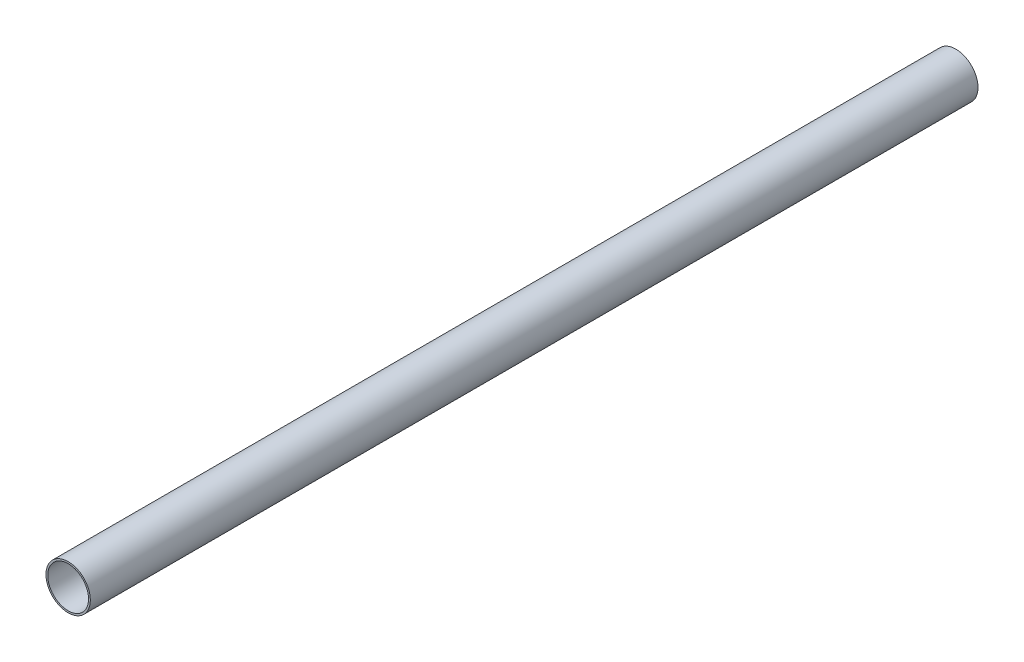
ISO-10303-21;
HEADER;
FILE_DESCRIPTION(('STEP AP214'),'2;1');
FILE_NAME('part.step','',(''),(''),'','','');
FILE_SCHEMA(('AUTOMOTIVE_DESIGN { 1 0 10303 214 1 1 1 1 }'));
ENDSEC;
DATA;
#1=APPLICATION_CONTEXT('core data for automotive mechanical design processes');
#2=APPLICATION_PROTOCOL_DEFINITION('international standard','automotive_design',2000,#1);
#3=PRODUCT_CONTEXT('',#1,'mechanical');
#4=PRODUCT('Part','Part','',(#3));
#5=PRODUCT_RELATED_PRODUCT_CATEGORY('part','',(#4));
#6=PRODUCT_DEFINITION_FORMATION('','',#4);
#7=PRODUCT_DEFINITION_CONTEXT('part definition',#1,'design');
#8=PRODUCT_DEFINITION('design','',#6,#7);
#9=PRODUCT_DEFINITION_SHAPE('','',#8);
#10=(LENGTH_UNIT() NAMED_UNIT(*) SI_UNIT(.MILLI.,.METRE.));
#11=(NAMED_UNIT(*) PLANE_ANGLE_UNIT() SI_UNIT($,.RADIAN.));
#12=(NAMED_UNIT(*) SI_UNIT($,.STERADIAN.) SOLID_ANGLE_UNIT());
#13=UNCERTAINTY_MEASURE_WITH_UNIT(LENGTH_MEASURE(1.E-05),#10,'distance_accuracy_value','');
#14=(GEOMETRIC_REPRESENTATION_CONTEXT(3) GLOBAL_UNCERTAINTY_ASSIGNED_CONTEXT((#13)) GLOBAL_UNIT_ASSIGNED_CONTEXT((#10,
#11,#12)) REPRESENTATION_CONTEXT('',''));
#15=CARTESIAN_POINT('',(0.,0.,0.));
#16=DIRECTION('',(0.,0.,1.));
#17=DIRECTION('',(1.,0.,0.));
#18=AXIS2_PLACEMENT_3D('',#15,#16,#17);
#19=CARTESIAN_POINT('',(0.,0.,250.));
#20=DIRECTION('',(0.,0.,1.));
#21=DIRECTION('',(1.,0.,0.));
#22=AXIS2_PLACEMENT_3D('',#19,#20,#21);
#23=PLANE('',#22);
#24=CARTESIAN_POINT('',(0.,0.,250.));
#25=DIRECTION('',(0.,0.,1.));
#26=DIRECTION('',(1.,0.,0.));
#27=AXIS2_PLACEMENT_3D('',#24,#25,#26);
#28=CIRCLE('',#27,12.5);
#29=CARTESIAN_POINT('',(12.5,0.,250.));
#30=VERTEX_POINT('',#29);
#31=EDGE_CURVE('E10',#30,#30,#28,.T.);
#32=ORIENTED_EDGE('',*,*,#31,.T.);
#33=EDGE_LOOP('',(#32));
#34=FACE_BOUND('',#33,.T.);
#35=CARTESIAN_POINT('',(0.,0.,250.));
#36=DIRECTION('',(0.,0.,1.));
#37=DIRECTION('',(1.,0.,0.));
#38=AXIS2_PLACEMENT_3D('',#35,#36,#37);
#39=CIRCLE('',#38,11.5);
#40=CARTESIAN_POINT('',(11.5,0.,250.));
#41=VERTEX_POINT('',#40);
#42=EDGE_CURVE('E46',#41,#41,#39,.T.);
#43=ORIENTED_EDGE('',*,*,#42,.F.);
#44=EDGE_LOOP('',(#43));
#45=FACE_BOUND('',#44,.T.);
#46=ADVANCED_FACE('F35',(#34,#45),#23,.T.);
#47=CARTESIAN_POINT('',(0.,0.,-250.));
#48=DIRECTION('',(0.,0.,1.));
#49=DIRECTION('',(1.,0.,0.));
#50=AXIS2_PLACEMENT_3D('',#47,#48,#49);
#51=PLANE('',#50);
#52=CARTESIAN_POINT('',(0.,0.,-250.));
#53=DIRECTION('',(0.,0.,1.));
#54=DIRECTION('',(1.,0.,0.));
#55=AXIS2_PLACEMENT_3D('',#52,#53,#54);
#56=CIRCLE('',#55,12.5);
#57=CARTESIAN_POINT('',(12.5,0.,-250.));
#58=VERTEX_POINT('',#57);
#59=EDGE_CURVE('E39',#58,#58,#56,.T.);
#60=ORIENTED_EDGE('',*,*,#59,.F.);
#61=EDGE_LOOP('',(#60));
#62=FACE_BOUND('',#61,.T.);
#63=CARTESIAN_POINT('',(0.,0.,-250.));
#64=DIRECTION('',(0.,0.,1.));
#65=DIRECTION('',(1.,0.,0.));
#66=AXIS2_PLACEMENT_3D('',#63,#64,#65);
#67=CIRCLE('',#66,11.5);
#68=CARTESIAN_POINT('',(11.5,0.,-250.));
#69=VERTEX_POINT('',#68);
#70=EDGE_CURVE('E48',#69,#69,#67,.T.);
#71=ORIENTED_EDGE('',*,*,#70,.T.);
#72=EDGE_LOOP('',(#71));
#73=FACE_BOUND('',#72,.T.);
#74=ADVANCED_FACE('F58',(#62,#73),#51,.F.);
#75=CARTESIAN_POINT('',(0.,0.,250.));
#76=DIRECTION('',(0.,0.,-1.));
#77=DIRECTION('',(-1.,0.,0.));
#78=AXIS2_PLACEMENT_3D('',#75,#76,#77);
#79=CYLINDRICAL_SURFACE('',#78,12.5);
#80=ORIENTED_EDGE('',*,*,#31,.F.);
#81=EDGE_LOOP('',(#80));
#82=FACE_BOUND('',#81,.T.);
#83=ORIENTED_EDGE('',*,*,#59,.T.);
#84=EDGE_LOOP('',(#83));
#85=FACE_BOUND('',#84,.T.);
#86=ADVANCED_FACE('F37',(#82,#85),#79,.T.);
#87=CARTESIAN_POINT('',(0.,0.,250.));
#88=DIRECTION('',(0.,0.,-1.));
#89=DIRECTION('',(-1.,0.,0.));
#90=AXIS2_PLACEMENT_3D('',#87,#88,#89);
#91=CYLINDRICAL_SURFACE('',#90,11.5);
#92=ORIENTED_EDGE('',*,*,#42,.T.);
#93=EDGE_LOOP('',(#92));
#94=FACE_BOUND('',#93,.T.);
#95=ORIENTED_EDGE('',*,*,#70,.F.);
#96=EDGE_LOOP('',(#95));
#97=FACE_BOUND('',#96,.T.);
#98=ADVANCED_FACE('F54',(#94,#97),#91,.F.);
#99=CLOSED_SHELL('',(#46,#74,#86,#98));
#100=MANIFOLD_SOLID_BREP('B2',#99);
#101=ADVANCED_BREP_SHAPE_REPRESENTATION('',(#18,#100),#14);
#102=SHAPE_DEFINITION_REPRESENTATION(#9,#101);
ENDSEC;
END-ISO-10303-21;
